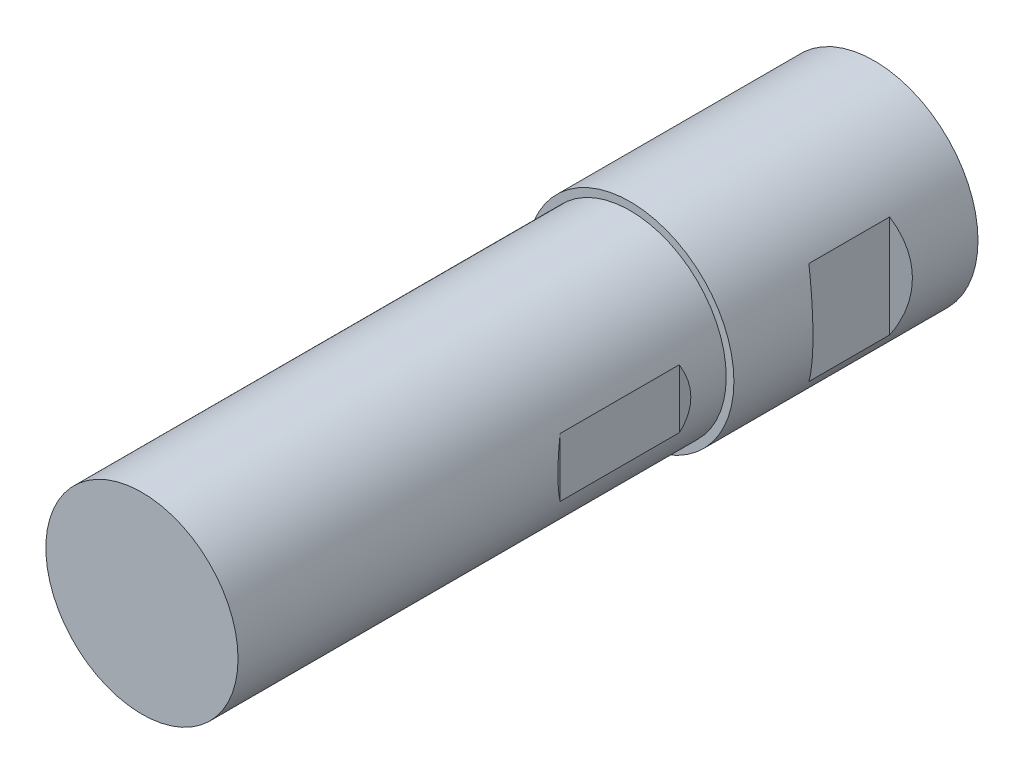
ISO-10303-21;
HEADER;
FILE_DESCRIPTION(('STEP AP214'),'2;1');
FILE_NAME('part.step','',(''),(''),'','','');
FILE_SCHEMA(('AUTOMOTIVE_DESIGN { 1 0 10303 214 1 1 1 1 }'));
ENDSEC;
DATA;
#1=APPLICATION_CONTEXT('core data for automotive mechanical design processes');
#2=APPLICATION_PROTOCOL_DEFINITION('international standard','automotive_design',2000,#1);
#3=PRODUCT_CONTEXT('',#1,'mechanical');
#4=PRODUCT('Part','Part','',(#3));
#5=PRODUCT_RELATED_PRODUCT_CATEGORY('part','',(#4));
#6=PRODUCT_DEFINITION_FORMATION('','',#4);
#7=PRODUCT_DEFINITION_CONTEXT('part definition',#1,'design');
#8=PRODUCT_DEFINITION('design','',#6,#7);
#9=PRODUCT_DEFINITION_SHAPE('','',#8);
#10=(LENGTH_UNIT() NAMED_UNIT(*) SI_UNIT(.MILLI.,.METRE.));
#11=(NAMED_UNIT(*) PLANE_ANGLE_UNIT() SI_UNIT($,.RADIAN.));
#12=(NAMED_UNIT(*) SI_UNIT($,.STERADIAN.) SOLID_ANGLE_UNIT());
#13=UNCERTAINTY_MEASURE_WITH_UNIT(LENGTH_MEASURE(1.E-05),#10,'distance_accuracy_value','');
#14=(GEOMETRIC_REPRESENTATION_CONTEXT(3) GLOBAL_UNCERTAINTY_ASSIGNED_CONTEXT((#13)) GLOBAL_UNIT_ASSIGNED_CONTEXT((#10,
#11,#12)) REPRESENTATION_CONTEXT('',''));
#15=CARTESIAN_POINT('',(0.,0.,0.));
#16=DIRECTION('',(0.,0.,1.));
#17=DIRECTION('',(1.,0.,0.));
#18=AXIS2_PLACEMENT_3D('',#15,#16,#17);
#19=CARTESIAN_POINT('',(0.,0.,63.5));
#20=DIRECTION('',(0.,0.,-1.));
#21=DIRECTION('',(-1.,0.,0.));
#22=AXIS2_PLACEMENT_3D('',#19,#20,#21);
#23=CYLINDRICAL_SURFACE('',#22,27.);
#24=CARTESIAN_POINT('',(0.,0.,0.));
#25=DIRECTION('',(0.,0.,1.));
#26=DIRECTION('',(1.,0.,0.));
#27=AXIS2_PLACEMENT_3D('',#24,#25,#26);
#28=CIRCLE('',#27,27.);
#29=CARTESIAN_POINT('',(27.,0.,0.));
#30=VERTEX_POINT('',#29);
#31=EDGE_CURVE('E202',#30,#30,#28,.T.);
#32=ORIENTED_EDGE('',*,*,#31,.T.);
#33=EDGE_LOOP('',(#32));
#34=FACE_BOUND('',#33,.T.);
#35=CARTESIAN_POINT('',(0.,0.,63.5));
#36=DIRECTION('',(0.,0.,1.));
#37=DIRECTION('',(1.,0.,0.));
#38=AXIS2_PLACEMENT_3D('',#35,#36,#37);
#39=CIRCLE('',#38,27.);
#40=CARTESIAN_POINT('',(27.,0.,63.5));
#41=VERTEX_POINT('',#40);
#42=EDGE_CURVE('E206',#41,#41,#39,.T.);
#43=ORIENTED_EDGE('',*,*,#42,.F.);
#44=EDGE_LOOP('',(#43));
#45=FACE_BOUND('',#44,.T.);
#46=CARTESIAN_POINT('',(0.,0.,24.124377493296));
#47=DIRECTION('',(0.571718278958655,0.,-0.820450004268727));
#48=DIRECTION('',(-0.820450004268727,0.,-0.571718278958655));
#49=AXIS2_PLACEMENT_3D('',#46,#47,#48);
#50=ELLIPSE('',#49,32.9087694064495,27.);
#51=CARTESIAN_POINT('',(23.5,13.2947358003083,40.5));
#52=VERTEX_POINT('',#51);
#53=CARTESIAN_POINT('',(23.5,-13.2947358003083,40.5));
#54=VERTEX_POINT('',#53);
#55=EDGE_CURVE('E151',#52,#54,#50,.T.);
#56=ORIENTED_EDGE('',*,*,#55,.F.);
#57=DIRECTION('',(0.,0.,-1.));
#58=VECTOR('',#57,1.);
#59=CARTESIAN_POINT('',(23.5,13.2947358003083,63.5));
#60=LINE('',#59,#58);
#61=CARTESIAN_POINT('',(23.5,13.2947358003083,19.5));
#62=VERTEX_POINT('',#61);
#63=EDGE_CURVE('E158',#52,#62,#60,.T.);
#64=ORIENTED_EDGE('',*,*,#63,.T.);
#65=CARTESIAN_POINT('',(0.,0.,35.875622506704));
#66=DIRECTION('',(-0.571718278958653,0.,-0.820450004268728));
#67=DIRECTION('',(0.820450004268728,0.,-0.571718278958653));
#68=AXIS2_PLACEMENT_3D('',#65,#66,#67);
#69=ELLIPSE('',#68,32.9087694064494,27.);
#70=CARTESIAN_POINT('',(23.5,-13.2947358003083,19.5));
#71=VERTEX_POINT('',#70);
#72=EDGE_CURVE('E154',#62,#71,#69,.T.);
#73=ORIENTED_EDGE('',*,*,#72,.T.);
#74=DIRECTION('',(0.,0.,-1.));
#75=VECTOR('',#74,1.);
#76=CARTESIAN_POINT('',(23.5,-13.2947358003083,63.5));
#77=LINE('',#76,#75);
#78=EDGE_CURVE('E147',#71,#54,#77,.F.);
#79=ORIENTED_EDGE('',*,*,#78,.T.);
#80=EDGE_LOOP('',(#56,#64,#73,#79));
#81=FACE_BOUND('',#80,.T.);
#82=CARTESIAN_POINT('',(0.,0.,35.875622506704));
#83=DIRECTION('',(-0.571718278958653,0.,0.820450004268728));
#84=DIRECTION('',(-0.820450004268728,0.,-0.571718278958653));
#85=AXIS2_PLACEMENT_3D('',#82,#83,#84);
#86=ELLIPSE('',#85,32.9087694064494,27.);
#87=CARTESIAN_POINT('',(-23.5,13.2947358003083,19.5));
#88=VERTEX_POINT('',#87);
#89=CARTESIAN_POINT('',(-23.5,-13.2947358003083,19.5));
#90=VERTEX_POINT('',#89);
#91=EDGE_CURVE('E11',#88,#90,#86,.T.);
#92=ORIENTED_EDGE('',*,*,#91,.F.);
#93=DIRECTION('',(0.,0.,-1.));
#94=VECTOR('',#93,1.);
#95=CARTESIAN_POINT('',(-23.5,13.2947358003083,63.5));
#96=LINE('',#95,#94);
#97=CARTESIAN_POINT('',(-23.5,13.2947358003083,40.5));
#98=VERTEX_POINT('',#97);
#99=EDGE_CURVE('E47',#98,#88,#96,.T.);
#100=ORIENTED_EDGE('',*,*,#99,.F.);
#101=CARTESIAN_POINT('',(0.,0.,24.124377493296));
#102=DIRECTION('',(0.571718278958653,0.,0.820450004268728));
#103=DIRECTION('',(0.820450004268728,0.,-0.571718278958653));
#104=AXIS2_PLACEMENT_3D('',#101,#102,#103);
#105=ELLIPSE('',#104,32.9087694064494,27.);
#106=CARTESIAN_POINT('',(-23.5,-13.2947358003083,40.5));
#107=VERTEX_POINT('',#106);
#108=EDGE_CURVE('E162',#98,#107,#105,.T.);
#109=ORIENTED_EDGE('',*,*,#108,.T.);
#110=DIRECTION('',(0.,0.,-1.));
#111=VECTOR('',#110,1.);
#112=CARTESIAN_POINT('',(-23.5,-13.2947358003083,63.5));
#113=LINE('',#112,#111);
#114=EDGE_CURVE('E166',#90,#107,#113,.F.);
#115=ORIENTED_EDGE('',*,*,#114,.F.);
#116=EDGE_LOOP('',(#92,#100,#109,#115));
#117=FACE_BOUND('',#116,.T.);
#118=ADVANCED_FACE('F39',(#34,#45,#81,#117),#23,.T.);
#119=CARTESIAN_POINT('',(0.,0.,190.5));
#120=DIRECTION('',(0.,0.,-1.));
#121=DIRECTION('',(-1.,0.,0.));
#122=AXIS2_PLACEMENT_3D('',#119,#120,#121);
#123=CYLINDRICAL_SURFACE('',#122,25.);
#124=DIRECTION('',(0.,0.,-1.));
#125=VECTOR('',#124,1.);
#126=CARTESIAN_POINT('',(23.8,7.65245058788356,190.5));
#127=LINE('',#126,#125);
#128=CARTESIAN_POINT('',(23.8,7.65245058788355,105.5));
#129=VERTEX_POINT('',#128);
#130=CARTESIAN_POINT('',(23.8,7.65245058788355,74.5));
#131=VERTEX_POINT('',#130);
#132=EDGE_CURVE('E143',#129,#131,#127,.T.);
#133=ORIENTED_EDGE('',*,*,#132,.T.);
#134=CARTESIAN_POINT('',(0.,0.,109.978518241803));
#135=DIRECTION('',(-0.830451696662299,0.,-0.557090638505719));
#136=DIRECTION('',(0.557090638505719,0.,-0.830451696662299));
#137=AXIS2_PLACEMENT_3D('',#134,#135,#136);
#138=ELLIPSE('',#137,44.8760009090395,25.);
#139=CARTESIAN_POINT('',(23.8,-7.65245058788356,74.5));
#140=VERTEX_POINT('',#139);
#141=EDGE_CURVE('E139',#131,#140,#138,.T.);
#142=ORIENTED_EDGE('',*,*,#141,.T.);
#143=DIRECTION('',(0.,0.,-1.));
#144=VECTOR('',#143,1.);
#145=CARTESIAN_POINT('',(23.8,-7.65245058788356,190.5));
#146=LINE('',#145,#144);
#147=CARTESIAN_POINT('',(23.8,-7.65245058788356,105.5));
#148=VERTEX_POINT('',#147);
#149=EDGE_CURVE('E126',#140,#148,#146,.F.);
#150=ORIENTED_EDGE('',*,*,#149,.T.);
#151=CARTESIAN_POINT('',(0.,0.,70.0214817581968));
#152=DIRECTION('',(0.830451696662302,0.,-0.557090638505714));
#153=DIRECTION('',(-0.557090638505714,0.,-0.830451696662302));
#154=AXIS2_PLACEMENT_3D('',#151,#152,#153);
#155=ELLIPSE('',#154,44.8760009090398,25.);
#156=EDGE_CURVE('E131',#129,#148,#155,.T.);
#157=ORIENTED_EDGE('',*,*,#156,.F.);
#158=EDGE_LOOP('',(#133,#142,#150,#157));
#159=FACE_BOUND('',#158,.T.);
#160=CARTESIAN_POINT('',(0.,0.,63.5));
#161=DIRECTION('',(0.,0.,1.));
#162=DIRECTION('',(1.,0.,0.));
#163=AXIS2_PLACEMENT_3D('',#160,#161,#162);
#164=CIRCLE('',#163,25.);
#165=CARTESIAN_POINT('',(25.,0.,63.5));
#166=VERTEX_POINT('',#165);
#167=EDGE_CURVE('E112',#166,#166,#164,.T.);
#168=ORIENTED_EDGE('',*,*,#167,.T.);
#169=EDGE_LOOP('',(#168));
#170=FACE_BOUND('',#169,.T.);
#171=CARTESIAN_POINT('',(0.,0.,190.5));
#172=DIRECTION('',(0.,0.,1.));
#173=DIRECTION('',(1.,0.,0.));
#174=AXIS2_PLACEMENT_3D('',#171,#172,#173);
#175=CIRCLE('',#174,25.);
#176=CARTESIAN_POINT('',(25.,0.,190.5));
#177=VERTEX_POINT('',#176);
#178=EDGE_CURVE('E227',#177,#177,#175,.T.);
#179=ORIENTED_EDGE('',*,*,#178,.F.);
#180=EDGE_LOOP('',(#179));
#181=FACE_BOUND('',#180,.T.);
#182=DIRECTION('',(0.,0.,-1.));
#183=VECTOR('',#182,1.);
#184=CARTESIAN_POINT('',(-23.8,7.65245058788364,190.5));
#185=LINE('',#184,#183);
#186=CARTESIAN_POINT('',(-23.8,7.65245058788361,105.5));
#187=VERTEX_POINT('',#186);
#188=CARTESIAN_POINT('',(-23.8,7.65245058788364,74.5));
#189=VERTEX_POINT('',#188);
#190=EDGE_CURVE('E117',#187,#189,#185,.T.);
#191=ORIENTED_EDGE('',*,*,#190,.F.);
#192=CARTESIAN_POINT('',(0.,0.,70.0214817581973));
#193=DIRECTION('',(0.830451696662298,0.,0.55709063850572));
#194=DIRECTION('',(0.55709063850572,0.,-0.830451696662298));
#195=AXIS2_PLACEMENT_3D('',#192,#193,#194);
#196=ELLIPSE('',#195,44.8760009090394,25.);
#197=CARTESIAN_POINT('',(-23.8,-7.65245058788361,105.5));
#198=VERTEX_POINT('',#197);
#199=EDGE_CURVE('E102',#187,#198,#196,.T.);
#200=ORIENTED_EDGE('',*,*,#199,.T.);
#201=DIRECTION('',(0.,0.,-1.));
#202=VECTOR('',#201,1.);
#203=CARTESIAN_POINT('',(-23.8,-7.65245058788364,190.5));
#204=LINE('',#203,#202);
#205=CARTESIAN_POINT('',(-23.8,-7.65245058788364,74.5));
#206=VERTEX_POINT('',#205);
#207=EDGE_CURVE('E111',#206,#198,#204,.F.);
#208=ORIENTED_EDGE('',*,*,#207,.F.);
#209=CARTESIAN_POINT('',(0.,0.,109.978518241803));
#210=DIRECTION('',(-0.830451696662299,0.,0.557090638505719));
#211=DIRECTION('',(-0.557090638505719,0.,-0.830451696662299));
#212=AXIS2_PLACEMENT_3D('',#209,#210,#211);
#213=ELLIPSE('',#212,44.8760009090395,25.);
#214=EDGE_CURVE('E124',#189,#206,#213,.T.);
#215=ORIENTED_EDGE('',*,*,#214,.F.);
#216=EDGE_LOOP('',(#191,#200,#208,#215));
#217=FACE_BOUND('',#216,.T.);
#218=ADVANCED_FACE('F123',(#159,#170,#181,#217),#123,.T.);
#219=CARTESIAN_POINT('',(0.,0.,63.5));
#220=DIRECTION('',(0.,0.,1.));
#221=DIRECTION('',(1.,0.,0.));
#222=AXIS2_PLACEMENT_3D('',#219,#220,#221);
#223=PLANE('',#222);
#224=ORIENTED_EDGE('',*,*,#167,.F.);
#225=EDGE_LOOP('',(#224));
#226=FACE_BOUND('',#225,.T.);
#227=ORIENTED_EDGE('',*,*,#42,.T.);
#228=EDGE_LOOP('',(#227));
#229=FACE_BOUND('',#228,.T.);
#230=ADVANCED_FACE('F196',(#226,#229),#223,.T.);
#231=CARTESIAN_POINT('',(0.,0.,0.));
#232=DIRECTION('',(0.,0.,1.));
#233=DIRECTION('',(1.,0.,0.));
#234=AXIS2_PLACEMENT_3D('',#231,#232,#233);
#235=PLANE('',#234);
#236=ORIENTED_EDGE('',*,*,#31,.F.);
#237=EDGE_LOOP('',(#236));
#238=FACE_BOUND('',#237,.T.);
#239=ADVANCED_FACE('F241',(#238),#235,.F.);
#240=CARTESIAN_POINT('',(0.,0.,190.5));
#241=DIRECTION('',(0.,0.,1.));
#242=DIRECTION('',(1.,0.,0.));
#243=AXIS2_PLACEMENT_3D('',#240,#241,#242);
#244=PLANE('',#243);
#245=ORIENTED_EDGE('',*,*,#178,.T.);
#246=EDGE_LOOP('',(#245));
#247=FACE_BOUND('',#246,.T.);
#248=ADVANCED_FACE('F247',(#247),#244,.T.);
#249=CARTESIAN_POINT('',(-50.8801170003061,-27.,34.1318308829617));
#250=DIRECTION('',(-0.830451696662299,0.,0.557090638505719));
#251=DIRECTION('',(0.557090638505719,0.,0.830451696662299));
#252=AXIS2_PLACEMENT_3D('',#249,#250,#251);
#253=PLANE('',#252);
#254=ORIENTED_EDGE('',*,*,#214,.T.);
#255=DIRECTION('',(0.,1.,0.));
#256=VECTOR('',#255,1.);
#257=CARTESIAN_POINT('',(-23.8,-27.,74.5));
#258=LINE('',#257,#256);
#259=EDGE_CURVE('E120',#206,#189,#258,.T.);
#260=ORIENTED_EDGE('',*,*,#259,.T.);
#261=EDGE_LOOP('',(#254,#260));
#262=FACE_BOUND('',#261,.T.);
#263=ADVANCED_FACE('F253',(#262),#253,.T.);
#264=CARTESIAN_POINT('',(-23.8,-27.,0.));
#265=DIRECTION('',(-1.,0.,0.));
#266=DIRECTION('',(0.,0.,1.));
#267=AXIS2_PLACEMENT_3D('',#264,#265,#266);
#268=PLANE('',#267);
#269=ORIENTED_EDGE('',*,*,#190,.T.);
#270=ORIENTED_EDGE('',*,*,#259,.F.);
#271=ORIENTED_EDGE('',*,*,#207,.T.);
#272=DIRECTION('',(0.,1.,0.));
#273=VECTOR('',#272,1.);
#274=CARTESIAN_POINT('',(-23.8,-27.,105.5));
#275=LINE('',#274,#273);
#276=EDGE_CURVE('E105',#198,#187,#275,.T.);
#277=ORIENTED_EDGE('',*,*,#276,.T.);
#278=EDGE_LOOP('',(#269,#270,#271,#277));
#279=FACE_BOUND('',#278,.T.);
#280=ADVANCED_FACE('F115',(#279),#268,.T.);
#281=CARTESIAN_POINT('',(32.3945188692104,-27.,21.7311654289661));
#282=DIRECTION('',(0.830451696662298,0.,0.55709063850572));
#283=DIRECTION('',(0.55709063850572,0.,-0.830451696662298));
#284=AXIS2_PLACEMENT_3D('',#281,#282,#283);
#285=PLANE('',#284);
#286=ORIENTED_EDGE('',*,*,#276,.F.);
#287=ORIENTED_EDGE('',*,*,#199,.F.);
#288=EDGE_LOOP('',(#286,#287));
#289=FACE_BOUND('',#288,.T.);
#290=ADVANCED_FACE('F104',(#289),#285,.F.);
#291=CARTESIAN_POINT('',(25.,-27.,72.7111671474721));
#292=DIRECTION('',(-0.830451696662299,0.,-0.557090638505719));
#293=DIRECTION('',(-0.557090638505719,0.,0.830451696662299));
#294=AXIS2_PLACEMENT_3D('',#291,#292,#293);
#295=PLANE('',#294);
#296=ORIENTED_EDGE('',*,*,#141,.F.);
#297=DIRECTION('',(0.,1.,0.));
#298=VECTOR('',#297,1.);
#299=CARTESIAN_POINT('',(23.8,-27.,74.5));
#300=LINE('',#299,#298);
#301=EDGE_CURVE('E181',#140,#131,#300,.T.);
#302=ORIENTED_EDGE('',*,*,#301,.F.);
#303=EDGE_LOOP('',(#296,#302));
#304=FACE_BOUND('',#303,.T.);
#305=ADVANCED_FACE('F260',(#304),#295,.F.);
#306=CARTESIAN_POINT('',(25.,-27.,107.288832852528));
#307=DIRECTION('',(0.830451696662302,0.,-0.557090638505714));
#308=DIRECTION('',(-0.557090638505714,0.,-0.830451696662302));
#309=AXIS2_PLACEMENT_3D('',#306,#307,#308);
#310=PLANE('',#309);
#311=DIRECTION('',(0.,1.,0.));
#312=VECTOR('',#311,1.);
#313=CARTESIAN_POINT('',(23.8,-27.,105.5));
#314=LINE('',#313,#312);
#315=EDGE_CURVE('E215',#148,#129,#314,.T.);
#316=ORIENTED_EDGE('',*,*,#315,.T.);
#317=ORIENTED_EDGE('',*,*,#156,.T.);
#318=EDGE_LOOP('',(#316,#317));
#319=FACE_BOUND('',#318,.T.);
#320=ADVANCED_FACE('F263',(#319),#310,.T.);
#321=CARTESIAN_POINT('',(23.8,-27.,74.5));
#322=DIRECTION('',(-1.,0.,0.));
#323=DIRECTION('',(0.,0.,1.));
#324=AXIS2_PLACEMENT_3D('',#321,#322,#323);
#325=PLANE('',#324);
#326=ORIENTED_EDGE('',*,*,#315,.F.);
#327=ORIENTED_EDGE('',*,*,#149,.F.);
#328=ORIENTED_EDGE('',*,*,#301,.T.);
#329=ORIENTED_EDGE('',*,*,#132,.F.);
#330=EDGE_LOOP('',(#326,#327,#328,#329));
#331=FACE_BOUND('',#330,.T.);
#332=ADVANCED_FACE('F266',(#331),#325,.F.);
#333=CARTESIAN_POINT('',(27.7579408871988,-27.,16.5329177606542));
#334=DIRECTION('',(-0.571718278958653,0.,-0.820450004268728));
#335=DIRECTION('',(-0.820450004268728,0.,0.571718278958653));
#336=AXIS2_PLACEMENT_3D('',#333,#334,#335);
#337=PLANE('',#336);
#338=DIRECTION('',(0.,1.,0.));
#339=VECTOR('',#338,1.);
#340=CARTESIAN_POINT('',(23.5,-27.,19.5));
#341=LINE('',#340,#339);
#342=EDGE_CURVE('E211',#71,#62,#341,.T.);
#343=ORIENTED_EDGE('',*,*,#342,.F.);
#344=ORIENTED_EDGE('',*,*,#72,.F.);
#345=EDGE_LOOP('',(#343,#344));
#346=FACE_BOUND('',#345,.T.);
#347=ADVANCED_FACE('F269',(#346),#337,.F.);
#348=CARTESIAN_POINT('',(27.7579408871988,-27.,43.4670822393458));
#349=DIRECTION('',(0.571718278958655,0.,-0.820450004268727));
#350=DIRECTION('',(-0.820450004268727,0.,-0.571718278958655));
#351=AXIS2_PLACEMENT_3D('',#348,#349,#350);
#352=PLANE('',#351);
#353=ORIENTED_EDGE('',*,*,#55,.T.);
#354=DIRECTION('',(0.,1.,0.));
#355=VECTOR('',#354,1.);
#356=CARTESIAN_POINT('',(23.5,-27.,40.5));
#357=LINE('',#356,#355);
#358=EDGE_CURVE('E61',#54,#52,#357,.T.);
#359=ORIENTED_EDGE('',*,*,#358,.T.);
#360=EDGE_LOOP('',(#353,#359));
#361=FACE_BOUND('',#360,.T.);
#362=ADVANCED_FACE('F209',(#361),#352,.T.);
#363=CARTESIAN_POINT('',(23.5,-27.,19.5));
#364=DIRECTION('',(-1.,0.,0.));
#365=DIRECTION('',(0.,0.,1.));
#366=AXIS2_PLACEMENT_3D('',#363,#364,#365);
#367=PLANE('',#366);
#368=ORIENTED_EDGE('',*,*,#358,.F.);
#369=ORIENTED_EDGE('',*,*,#78,.F.);
#370=ORIENTED_EDGE('',*,*,#342,.T.);
#371=ORIENTED_EDGE('',*,*,#63,.F.);
#372=EDGE_LOOP('',(#368,#369,#370,#371));
#373=FACE_BOUND('',#372,.T.);
#374=ADVANCED_FACE('F303',(#373),#367,.F.);
#375=CARTESIAN_POINT('',(-27.7579408871988,-27.,16.5329177606542));
#376=DIRECTION('',(-0.571718278958653,0.,0.820450004268728));
#377=DIRECTION('',(0.820450004268728,0.,0.571718278958653));
#378=AXIS2_PLACEMENT_3D('',#375,#376,#377);
#379=PLANE('',#378);
#380=ORIENTED_EDGE('',*,*,#91,.T.);
#381=DIRECTION('',(0.,1.,0.));
#382=VECTOR('',#381,1.);
#383=CARTESIAN_POINT('',(-23.5,-27.,19.5));
#384=LINE('',#383,#382);
#385=EDGE_CURVE('E174',#90,#88,#384,.T.);
#386=ORIENTED_EDGE('',*,*,#385,.T.);
#387=EDGE_LOOP('',(#380,#386));
#388=FACE_BOUND('',#387,.T.);
#389=ADVANCED_FACE('F179',(#388),#379,.T.);
#390=CARTESIAN_POINT('',(-23.5,-27.,19.5));
#391=DIRECTION('',(-1.,0.,0.));
#392=DIRECTION('',(0.,0.,1.));
#393=AXIS2_PLACEMENT_3D('',#390,#391,#392);
#394=PLANE('',#393);
#395=ORIENTED_EDGE('',*,*,#99,.T.);
#396=ORIENTED_EDGE('',*,*,#385,.F.);
#397=ORIENTED_EDGE('',*,*,#114,.T.);
#398=DIRECTION('',(0.,1.,0.));
#399=VECTOR('',#398,1.);
#400=CARTESIAN_POINT('',(-23.5,-27.,40.5));
#401=LINE('',#400,#399);
#402=EDGE_CURVE('E53',#107,#98,#401,.T.);
#403=ORIENTED_EDGE('',*,*,#402,.T.);
#404=EDGE_LOOP('',(#395,#396,#397,#403));
#405=FACE_BOUND('',#404,.T.);
#406=ADVANCED_FACE('F173',(#405),#394,.T.);
#407=CARTESIAN_POINT('',(-27.7579408871988,-27.,43.4670822393458));
#408=DIRECTION('',(0.571718278958653,0.,0.820450004268728));
#409=DIRECTION('',(0.820450004268728,0.,-0.571718278958653));
#410=AXIS2_PLACEMENT_3D('',#407,#408,#409);
#411=PLANE('',#410);
#412=ORIENTED_EDGE('',*,*,#402,.F.);
#413=ORIENTED_EDGE('',*,*,#108,.F.);
#414=EDGE_LOOP('',(#412,#413));
#415=FACE_BOUND('',#414,.T.);
#416=ADVANCED_FACE('F183',(#415),#411,.F.);
#417=CLOSED_SHELL('',(#118,#218,#230,#239,#248,#263,#280,#290,#305,#320,#332,#347,#362,#374,
#389,#406,#416));
#418=MANIFOLD_SOLID_BREP('B2',#417);
#419=ADVANCED_BREP_SHAPE_REPRESENTATION('',(#18,#418),#14);
#420=SHAPE_DEFINITION_REPRESENTATION(#9,#419);
ENDSEC;
END-ISO-10303-21;
